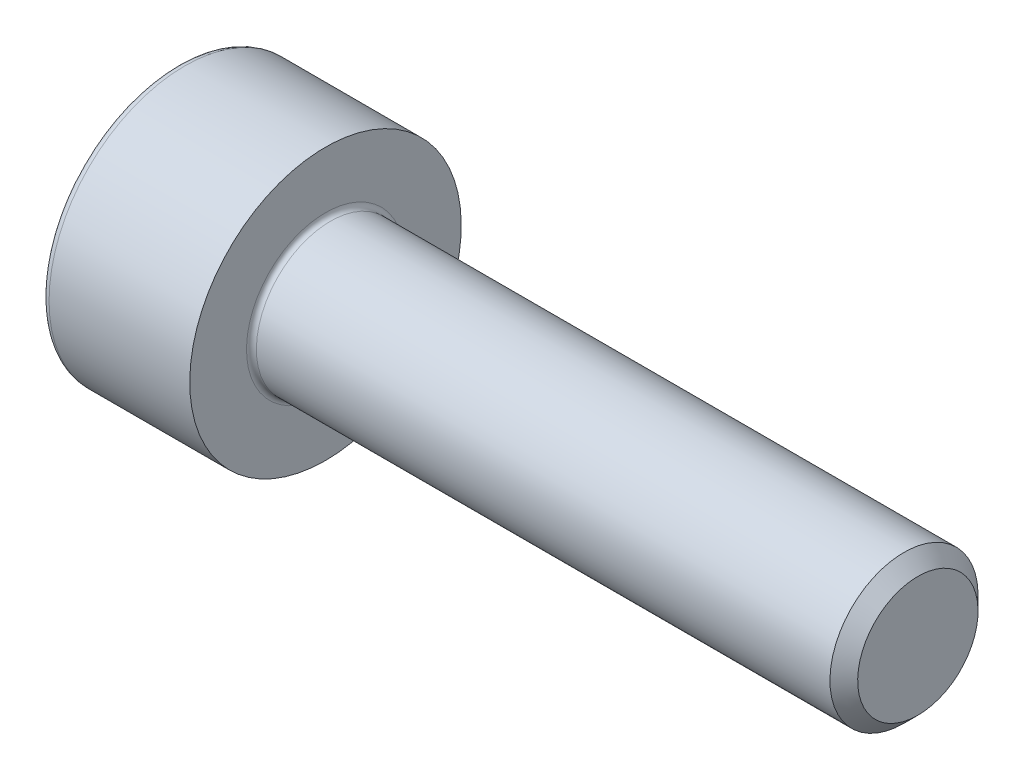
ISO-10303-21;
HEADER;
FILE_DESCRIPTION(('STEP AP214'),'2;1');
FILE_NAME('part.step','',(''),(''),'','','');
FILE_SCHEMA(('AUTOMOTIVE_DESIGN { 1 0 10303 214 1 1 1 1 }'));
ENDSEC;
DATA;
#1=APPLICATION_CONTEXT('core data for automotive mechanical design processes');
#2=APPLICATION_PROTOCOL_DEFINITION('international standard','automotive_design',2000,#1);
#3=PRODUCT_CONTEXT('',#1,'mechanical');
#4=PRODUCT('Part','Part','',(#3));
#5=PRODUCT_RELATED_PRODUCT_CATEGORY('part','',(#4));
#6=PRODUCT_DEFINITION_FORMATION('','',#4);
#7=PRODUCT_DEFINITION_CONTEXT('part definition',#1,'design');
#8=PRODUCT_DEFINITION('design','',#6,#7);
#9=PRODUCT_DEFINITION_SHAPE('','',#8);
#10=(LENGTH_UNIT() NAMED_UNIT(*) SI_UNIT(.MILLI.,.METRE.));
#11=(NAMED_UNIT(*) PLANE_ANGLE_UNIT() SI_UNIT($,.RADIAN.));
#12=(NAMED_UNIT(*) SI_UNIT($,.STERADIAN.) SOLID_ANGLE_UNIT());
#13=UNCERTAINTY_MEASURE_WITH_UNIT(LENGTH_MEASURE(1.E-05),#10,'distance_accuracy_value','');
#14=(GEOMETRIC_REPRESENTATION_CONTEXT(3) GLOBAL_UNCERTAINTY_ASSIGNED_CONTEXT((#13)) GLOBAL_UNIT_ASSIGNED_CONTEXT((#10,
#11,#12)) REPRESENTATION_CONTEXT('',''));
#15=CARTESIAN_POINT('',(0.,0.,0.));
#16=DIRECTION('',(0.,0.,1.));
#17=DIRECTION('',(1.,0.,0.));
#18=AXIS2_PLACEMENT_3D('',#15,#16,#17);
#19=CARTESIAN_POINT('',(-3.,0.,0.));
#20=DIRECTION('',(1.,0.,0.));
#21=DIRECTION('',(0.,1.,0.));
#22=AXIS2_PLACEMENT_3D('',#19,#20,#21);
#23=PLANE('',#22);
#24=CARTESIAN_POINT('',(-3.,0.,0.));
#25=DIRECTION('',(1.,0.,0.));
#26=DIRECTION('',(0.,1.,0.));
#27=AXIS2_PLACEMENT_3D('',#24,#25,#26);
#28=CIRCLE('',#27,2.6);
#29=CARTESIAN_POINT('',(-3.,2.6,0.));
#30=VERTEX_POINT('',#29);
#31=EDGE_CURVE('E151',#30,#30,#28,.F.);
#32=ORIENTED_EDGE('',*,*,#31,.T.);
#33=EDGE_LOOP('',(#32));
#34=FACE_BOUND('',#33,.T.);
#35=DIRECTION('',(0.,-0.5,-0.866025403784439));
#36=VECTOR('',#35,1.);
#37=CARTESIAN_POINT('',(-3.,1.47801668912544,0.));
#38=LINE('',#37,#36);
#39=CARTESIAN_POINT('',(-3.,1.47801668912544,0.));
#40=VERTEX_POINT('',#39);
#41=CARTESIAN_POINT('',(-3.,0.739008344562721,-1.28));
#42=VERTEX_POINT('',#41);
#43=EDGE_CURVE('E130',#40,#42,#38,.T.);
#44=ORIENTED_EDGE('',*,*,#43,.F.);
#45=DIRECTION('',(0.,0.5,-0.866025403784439));
#46=VECTOR('',#45,1.);
#47=CARTESIAN_POINT('',(-3.,0.739008344562721,1.28));
#48=LINE('',#47,#46);
#49=CARTESIAN_POINT('',(-3.,0.739008344562721,1.28));
#50=VERTEX_POINT('',#49);
#51=EDGE_CURVE('E56',#50,#40,#48,.T.);
#52=ORIENTED_EDGE('',*,*,#51,.F.);
#53=DIRECTION('',(0.,1.,0.));
#54=VECTOR('',#53,1.);
#55=CARTESIAN_POINT('',(-3.,-0.739008344562722,1.28));
#56=LINE('',#55,#54);
#57=CARTESIAN_POINT('',(-3.,-0.739008344562722,1.28));
#58=VERTEX_POINT('',#57);
#59=EDGE_CURVE('E139',#58,#50,#56,.T.);
#60=ORIENTED_EDGE('',*,*,#59,.F.);
#61=DIRECTION('',(0.,0.5,0.866025403784439));
#62=VECTOR('',#61,1.);
#63=CARTESIAN_POINT('',(-3.,-1.47801668912544,0.));
#64=LINE('',#63,#62);
#65=CARTESIAN_POINT('',(-3.,-1.47801668912544,0.));
#66=VERTEX_POINT('',#65);
#67=EDGE_CURVE('E137',#66,#58,#64,.T.);
#68=ORIENTED_EDGE('',*,*,#67,.F.);
#69=DIRECTION('',(0.,-0.5,0.866025403784439));
#70=VECTOR('',#69,1.);
#71=CARTESIAN_POINT('',(-3.,-0.739008344562721,-1.28));
#72=LINE('',#71,#70);
#73=CARTESIAN_POINT('',(-3.,-0.739008344562721,-1.28));
#74=VERTEX_POINT('',#73);
#75=EDGE_CURVE('E104',#74,#66,#72,.T.);
#76=ORIENTED_EDGE('',*,*,#75,.F.);
#77=DIRECTION('',(0.,-1.,0.));
#78=VECTOR('',#77,1.);
#79=CARTESIAN_POINT('',(-3.,0.739008344562721,-1.28));
#80=LINE('',#79,#78);
#81=EDGE_CURVE('E133',#42,#74,#80,.T.);
#82=ORIENTED_EDGE('',*,*,#81,.F.);
#83=EDGE_LOOP('',(#44,#52,#60,#68,#76,#82));
#84=FACE_BOUND('',#83,.T.);
#85=ADVANCED_FACE('F41',(#34,#84),#23,.F.);
#86=CARTESIAN_POINT('',(0.,0.,0.));
#87=DIRECTION('',(-1.,0.,0.));
#88=DIRECTION('',(0.,-1.,0.));
#89=AXIS2_PLACEMENT_3D('',#86,#87,#88);
#90=CYLINDRICAL_SURFACE('',#89,2.75);
#91=CARTESIAN_POINT('',(-2.85,0.,0.));
#92=DIRECTION('',(1.,0.,0.));
#93=DIRECTION('',(0.,1.,0.));
#94=AXIS2_PLACEMENT_3D('',#91,#92,#93);
#95=CIRCLE('',#94,2.75);
#96=CARTESIAN_POINT('',(-2.85,2.75,0.));
#97=VERTEX_POINT('',#96);
#98=EDGE_CURVE('E154',#97,#97,#95,.T.);
#99=ORIENTED_EDGE('',*,*,#98,.T.);
#100=EDGE_LOOP('',(#99));
#101=FACE_BOUND('',#100,.T.);
#102=CARTESIAN_POINT('',(0.,0.,0.));
#103=DIRECTION('',(-1.,0.,0.));
#104=DIRECTION('',(0.,-1.,0.));
#105=AXIS2_PLACEMENT_3D('',#102,#103,#104);
#106=CIRCLE('',#105,2.75);
#107=CARTESIAN_POINT('',(0.,-2.75,0.));
#108=VERTEX_POINT('',#107);
#109=EDGE_CURVE('E143',#108,#108,#106,.T.);
#110=ORIENTED_EDGE('',*,*,#109,.T.);
#111=EDGE_LOOP('',(#110));
#112=FACE_BOUND('',#111,.T.);
#113=ADVANCED_FACE('F179',(#101,#112),#90,.T.);
#114=CARTESIAN_POINT('',(0.,2.75,0.));
#115=DIRECTION('',(-1.,0.,0.));
#116=DIRECTION('',(0.,-1.,0.));
#117=AXIS2_PLACEMENT_3D('',#114,#115,#116);
#118=PLANE('',#117);
#119=CARTESIAN_POINT('',(0.,0.,0.));
#120=DIRECTION('',(-1.,0.,0.));
#121=DIRECTION('',(0.,-1.,0.));
#122=AXIS2_PLACEMENT_3D('',#119,#120,#121);
#123=CIRCLE('',#122,1.6);
#124=CARTESIAN_POINT('',(0.,-1.6,0.));
#125=VERTEX_POINT('',#124);
#126=EDGE_CURVE('E49',#125,#125,#123,.T.);
#127=ORIENTED_EDGE('',*,*,#126,.T.);
#128=EDGE_LOOP('',(#127));
#129=FACE_BOUND('',#128,.T.);
#130=ORIENTED_EDGE('',*,*,#109,.F.);
#131=EDGE_LOOP('',(#130));
#132=FACE_BOUND('',#131,.T.);
#133=ADVANCED_FACE('F165',(#129,#132),#118,.F.);
#134=CARTESIAN_POINT('',(0.,0.,0.));
#135=DIRECTION('',(-1.,0.,0.));
#136=DIRECTION('',(0.,-1.,0.));
#137=AXIS2_PLACEMENT_3D('',#134,#135,#136);
#138=CYLINDRICAL_SURFACE('',#137,1.5);
#139=CARTESIAN_POINT('',(0.1,0.,0.));
#140=DIRECTION('',(-1.,0.,0.));
#141=DIRECTION('',(0.,-1.,0.));
#142=AXIS2_PLACEMENT_3D('',#139,#140,#141);
#143=CIRCLE('',#142,1.5);
#144=CARTESIAN_POINT('',(0.1,-1.5,0.));
#145=VERTEX_POINT('',#144);
#146=EDGE_CURVE('E11',#145,#145,#143,.F.);
#147=ORIENTED_EDGE('',*,*,#146,.T.);
#148=EDGE_LOOP('',(#147));
#149=FACE_BOUND('',#148,.T.);
#150=CARTESIAN_POINT('',(11.719,0.,0.));
#151=DIRECTION('',(-1.,0.,0.));
#152=DIRECTION('',(0.,-1.,0.));
#153=AXIS2_PLACEMENT_3D('',#150,#151,#152);
#154=CIRCLE('',#153,1.5);
#155=CARTESIAN_POINT('',(11.719,-1.5,0.));
#156=VERTEX_POINT('',#155);
#157=EDGE_CURVE('E157',#156,#156,#154,.T.);
#158=ORIENTED_EDGE('',*,*,#157,.T.);
#159=EDGE_LOOP('',(#158));
#160=FACE_BOUND('',#159,.T.);
#161=ADVANCED_FACE('F204',(#149,#160),#138,.T.);
#162=CARTESIAN_POINT('',(12.,1.5,0.));
#163=DIRECTION('',(-1.,0.,0.));
#164=DIRECTION('',(0.,-1.,0.));
#165=AXIS2_PLACEMENT_3D('',#162,#163,#164);
#166=PLANE('',#165);
#167=CARTESIAN_POINT('',(12.,0.,0.));
#168=DIRECTION('',(-1.,0.,0.));
#169=DIRECTION('',(0.,-1.,0.));
#170=AXIS2_PLACEMENT_3D('',#167,#168,#169);
#171=CIRCLE('',#170,1.21899999999999);
#172=CARTESIAN_POINT('',(12.,-1.21899999999999,0.));
#173=VERTEX_POINT('',#172);
#174=EDGE_CURVE('E160',#173,#173,#171,.F.);
#175=ORIENTED_EDGE('',*,*,#174,.T.);
#176=EDGE_LOOP('',(#175));
#177=FACE_BOUND('',#176,.T.);
#178=ADVANCED_FACE('F208',(#177),#166,.F.);
#179=CARTESIAN_POINT('',(-1.7,0.739008344562721,1.28));
#180=DIRECTION('',(0.,0.866025403784439,0.5));
#181=DIRECTION('',(0.,-0.5,0.866025403784439));
#182=AXIS2_PLACEMENT_3D('',#179,#180,#181);
#183=PLANE('',#182);
#184=ORIENTED_EDGE('',*,*,#51,.T.);
#185=DIRECTION('',(-1.,0.,0.));
#186=VECTOR('',#185,1.);
#187=CARTESIAN_POINT('',(-1.7,1.47801668912544,0.));
#188=LINE('',#187,#186);
#189=CARTESIAN_POINT('',(-1.7,1.47801668912544,0.));
#190=VERTEX_POINT('',#189);
#191=EDGE_CURVE('E86',#190,#40,#188,.T.);
#192=ORIENTED_EDGE('',*,*,#191,.F.);
#193=DIRECTION('',(0.,0.5,-0.866025403784439));
#194=VECTOR('',#193,1.);
#195=CARTESIAN_POINT('',(-1.7,0.739008344562721,1.28));
#196=LINE('',#195,#194);
#197=CARTESIAN_POINT('',(-1.7,0.739008344562721,1.28));
#198=VERTEX_POINT('',#197);
#199=EDGE_CURVE('E141',#198,#190,#196,.T.);
#200=ORIENTED_EDGE('',*,*,#199,.F.);
#201=DIRECTION('',(-1.,0.,0.));
#202=VECTOR('',#201,1.);
#203=CARTESIAN_POINT('',(-1.7,0.739008344562721,1.28));
#204=LINE('',#203,#202);
#205=EDGE_CURVE('E64',#198,#50,#204,.T.);
#206=ORIENTED_EDGE('',*,*,#205,.T.);
#207=EDGE_LOOP('',(#184,#192,#200,#206));
#208=FACE_BOUND('',#207,.T.);
#209=ADVANCED_FACE('F213',(#208),#183,.F.);
#210=CARTESIAN_POINT('',(-1.7,-0.739008344562722,1.28));
#211=DIRECTION('',(0.,0.,1.));
#212=DIRECTION('',(1.,0.,0.));
#213=AXIS2_PLACEMENT_3D('',#210,#211,#212);
#214=PLANE('',#213);
#215=ORIENTED_EDGE('',*,*,#59,.T.);
#216=ORIENTED_EDGE('',*,*,#205,.F.);
#217=DIRECTION('',(0.,1.,0.));
#218=VECTOR('',#217,1.);
#219=CARTESIAN_POINT('',(-1.7,-0.739008344562722,1.28));
#220=LINE('',#219,#218);
#221=CARTESIAN_POINT('',(-1.7,-0.739008344562722,1.28));
#222=VERTEX_POINT('',#221);
#223=EDGE_CURVE('E116',#222,#198,#220,.T.);
#224=ORIENTED_EDGE('',*,*,#223,.F.);
#225=DIRECTION('',(-1.,0.,0.));
#226=VECTOR('',#225,1.);
#227=CARTESIAN_POINT('',(-1.7,-0.739008344562722,1.28));
#228=LINE('',#227,#226);
#229=EDGE_CURVE('E108',#222,#58,#228,.T.);
#230=ORIENTED_EDGE('',*,*,#229,.T.);
#231=EDGE_LOOP('',(#215,#216,#224,#230));
#232=FACE_BOUND('',#231,.T.);
#233=ADVANCED_FACE('F217',(#232),#214,.F.);
#234=CARTESIAN_POINT('',(-1.7,-1.47801668912544,0.));
#235=DIRECTION('',(0.,-0.866025403784439,0.5));
#236=DIRECTION('',(0.,-0.5,-0.866025403784439));
#237=AXIS2_PLACEMENT_3D('',#234,#235,#236);
#238=PLANE('',#237);
#239=ORIENTED_EDGE('',*,*,#67,.T.);
#240=ORIENTED_EDGE('',*,*,#229,.F.);
#241=DIRECTION('',(0.,0.5,0.866025403784439));
#242=VECTOR('',#241,1.);
#243=CARTESIAN_POINT('',(-1.7,-1.47801668912544,0.));
#244=LINE('',#243,#242);
#245=CARTESIAN_POINT('',(-1.7,-1.47801668912544,0.));
#246=VERTEX_POINT('',#245);
#247=EDGE_CURVE('E112',#246,#222,#244,.T.);
#248=ORIENTED_EDGE('',*,*,#247,.F.);
#249=DIRECTION('',(-1.,0.,0.));
#250=VECTOR('',#249,1.);
#251=CARTESIAN_POINT('',(-1.7,-1.47801668912544,0.));
#252=LINE('',#251,#250);
#253=EDGE_CURVE('E97',#246,#66,#252,.T.);
#254=ORIENTED_EDGE('',*,*,#253,.T.);
#255=EDGE_LOOP('',(#239,#240,#248,#254));
#256=FACE_BOUND('',#255,.T.);
#257=ADVANCED_FACE('F113',(#256),#238,.F.);
#258=CARTESIAN_POINT('',(-1.7,-0.739008344562721,-1.28));
#259=DIRECTION('',(0.,-0.866025403784439,-0.5));
#260=DIRECTION('',(0.,0.5,-0.866025403784439));
#261=AXIS2_PLACEMENT_3D('',#258,#259,#260);
#262=PLANE('',#261);
#263=ORIENTED_EDGE('',*,*,#75,.T.);
#264=ORIENTED_EDGE('',*,*,#253,.F.);
#265=DIRECTION('',(0.,-0.5,0.866025403784439));
#266=VECTOR('',#265,1.);
#267=CARTESIAN_POINT('',(-1.7,-0.739008344562721,-1.28));
#268=LINE('',#267,#266);
#269=CARTESIAN_POINT('',(-1.7,-0.739008344562721,-1.28));
#270=VERTEX_POINT('',#269);
#271=EDGE_CURVE('E101',#270,#246,#268,.T.);
#272=ORIENTED_EDGE('',*,*,#271,.F.);
#273=DIRECTION('',(-1.,0.,0.));
#274=VECTOR('',#273,1.);
#275=CARTESIAN_POINT('',(-1.7,-0.739008344562721,-1.28));
#276=LINE('',#275,#274);
#277=EDGE_CURVE('E109',#270,#74,#276,.T.);
#278=ORIENTED_EDGE('',*,*,#277,.T.);
#279=EDGE_LOOP('',(#263,#264,#272,#278));
#280=FACE_BOUND('',#279,.T.);
#281=ADVANCED_FACE('F99',(#280),#262,.F.);
#282=CARTESIAN_POINT('',(-1.7,0.739008344562721,-1.28));
#283=DIRECTION('',(0.,0.,-1.));
#284=DIRECTION('',(-1.,0.,0.));
#285=AXIS2_PLACEMENT_3D('',#282,#283,#284);
#286=PLANE('',#285);
#287=ORIENTED_EDGE('',*,*,#81,.T.);
#288=ORIENTED_EDGE('',*,*,#277,.F.);
#289=DIRECTION('',(0.,-1.,0.));
#290=VECTOR('',#289,1.);
#291=CARTESIAN_POINT('',(-1.7,0.739008344562721,-1.28));
#292=LINE('',#291,#290);
#293=CARTESIAN_POINT('',(-1.7,0.739008344562721,-1.28));
#294=VERTEX_POINT('',#293);
#295=EDGE_CURVE('E122',#294,#270,#292,.T.);
#296=ORIENTED_EDGE('',*,*,#295,.F.);
#297=DIRECTION('',(-1.,0.,0.));
#298=VECTOR('',#297,1.);
#299=CARTESIAN_POINT('',(-1.7,0.739008344562721,-1.28));
#300=LINE('',#299,#298);
#301=EDGE_CURVE('E146',#294,#42,#300,.T.);
#302=ORIENTED_EDGE('',*,*,#301,.T.);
#303=EDGE_LOOP('',(#287,#288,#296,#302));
#304=FACE_BOUND('',#303,.T.);
#305=ADVANCED_FACE('F220',(#304),#286,.F.);
#306=CARTESIAN_POINT('',(-1.7,1.47801668912544,0.));
#307=DIRECTION('',(0.,0.866025403784439,-0.5));
#308=DIRECTION('',(0.,0.5,0.866025403784439));
#309=AXIS2_PLACEMENT_3D('',#306,#307,#308);
#310=PLANE('',#309);
#311=ORIENTED_EDGE('',*,*,#43,.T.);
#312=ORIENTED_EDGE('',*,*,#301,.F.);
#313=DIRECTION('',(0.,-0.5,-0.866025403784439));
#314=VECTOR('',#313,1.);
#315=CARTESIAN_POINT('',(-1.7,1.47801668912544,0.));
#316=LINE('',#315,#314);
#317=EDGE_CURVE('E124',#190,#294,#316,.T.);
#318=ORIENTED_EDGE('',*,*,#317,.F.);
#319=ORIENTED_EDGE('',*,*,#191,.T.);
#320=EDGE_LOOP('',(#311,#312,#318,#319));
#321=FACE_BOUND('',#320,.T.);
#322=ADVANCED_FACE('F196',(#321),#310,.F.);
#323=CARTESIAN_POINT('',(-1.7,0.,0.));
#324=DIRECTION('',(-1.,0.,0.));
#325=DIRECTION('',(0.,0.,1.));
#326=AXIS2_PLACEMENT_3D('',#323,#324,#325);
#327=PLANE('',#326);
#328=ORIENTED_EDGE('',*,*,#199,.T.);
#329=ORIENTED_EDGE('',*,*,#317,.T.);
#330=ORIENTED_EDGE('',*,*,#295,.T.);
#331=ORIENTED_EDGE('',*,*,#271,.T.);
#332=ORIENTED_EDGE('',*,*,#247,.T.);
#333=ORIENTED_EDGE('',*,*,#223,.T.);
#334=EDGE_LOOP('',(#328,#329,#330,#331,#332,#333));
#335=FACE_BOUND('',#334,.T.);
#336=ADVANCED_FACE('F119',(#335),#327,.T.);
#337=CARTESIAN_POINT('',(-2.85,0.,0.));
#338=DIRECTION('',(1.,0.,0.));
#339=DIRECTION('',(0.,1.,0.));
#340=AXIS2_PLACEMENT_3D('',#337,#338,#339);
#341=TOROIDAL_SURFACE('',#340,2.6,0.15);
#342=ORIENTED_EDGE('',*,*,#98,.F.);
#343=EDGE_LOOP('',(#342));
#344=FACE_BOUND('',#343,.T.);
#345=ORIENTED_EDGE('',*,*,#31,.F.);
#346=EDGE_LOOP('',(#345));
#347=FACE_BOUND('',#346,.T.);
#348=ADVANCED_FACE('F175',(#344,#347),#341,.T.);
#349=CARTESIAN_POINT('',(11.719,0.,0.));
#350=DIRECTION('',(-1.,0.,0.));
#351=DIRECTION('',(0.,-1.,0.));
#352=AXIS2_PLACEMENT_3D('',#349,#350,#351);
#353=CONICAL_SURFACE('',#352,1.5,0.785398163397452);
#354=ORIENTED_EDGE('',*,*,#174,.F.);
#355=EDGE_LOOP('',(#354));
#356=FACE_BOUND('',#355,.T.);
#357=ORIENTED_EDGE('',*,*,#157,.F.);
#358=EDGE_LOOP('',(#357));
#359=FACE_BOUND('',#358,.T.);
#360=ADVANCED_FACE('F169',(#356,#359),#353,.T.);
#361=CARTESIAN_POINT('',(0.1,0.,0.));
#362=DIRECTION('',(-1.,0.,0.));
#363=DIRECTION('',(0.,-1.,0.));
#364=AXIS2_PLACEMENT_3D('',#361,#362,#363);
#365=TOROIDAL_SURFACE('',#364,1.6,0.1);
#366=ORIENTED_EDGE('',*,*,#146,.F.);
#367=EDGE_LOOP('',(#366));
#368=FACE_BOUND('',#367,.T.);
#369=ORIENTED_EDGE('',*,*,#126,.F.);
#370=EDGE_LOOP('',(#369));
#371=FACE_BOUND('',#370,.T.);
#372=ADVANCED_FACE('F43',(#368,#371),#365,.F.);
#373=CLOSED_SHELL('',(#85,#113,#133,#161,#178,#209,#233,#257,#281,#305,#322,#336,#348,#360,#372));
#374=MANIFOLD_SOLID_BREP('B2',#373);
#375=ADVANCED_BREP_SHAPE_REPRESENTATION('',(#18,#374),#14);
#376=SHAPE_DEFINITION_REPRESENTATION(#9,#375);
ENDSEC;
END-ISO-10303-21;
